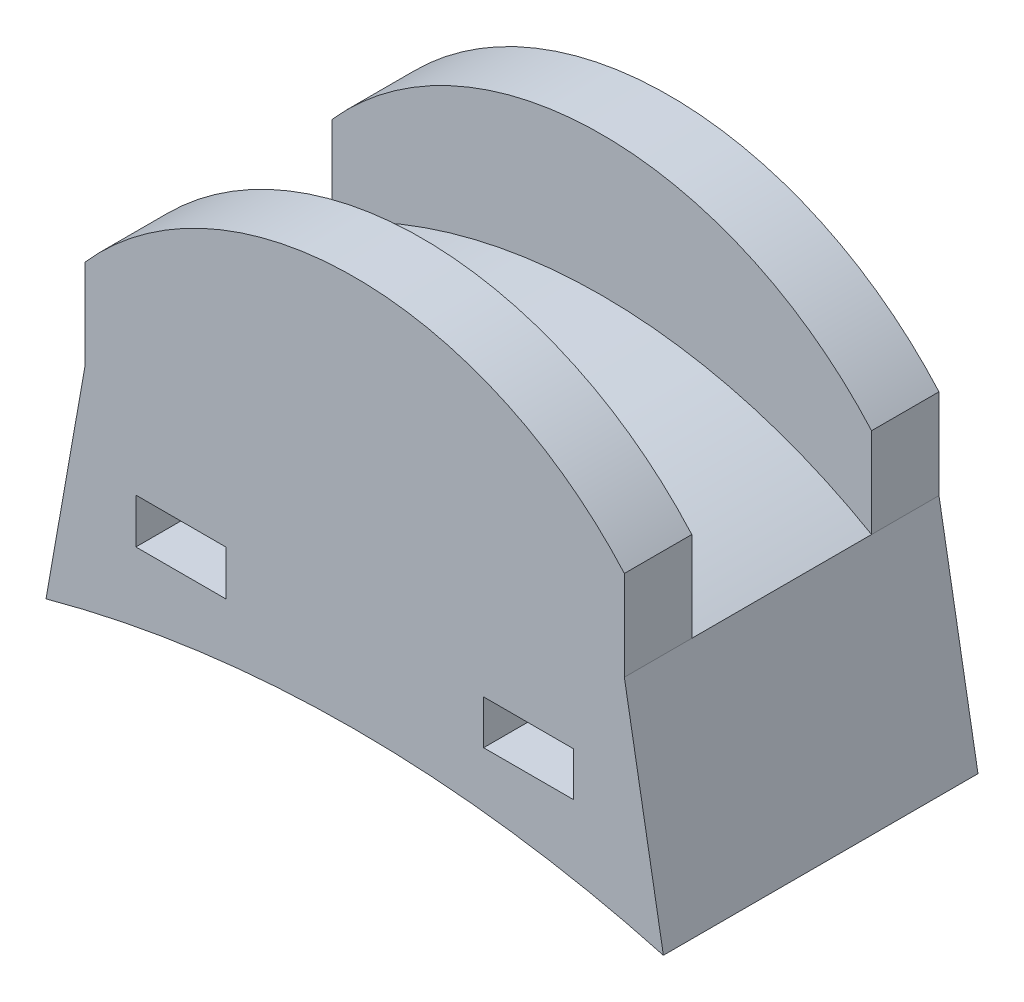
ISO-10303-21;
HEADER;
FILE_DESCRIPTION(('STEP AP214'),'2;1');
FILE_NAME('part.step','',(''),(''),'','','');
FILE_SCHEMA(('AUTOMOTIVE_DESIGN { 1 0 10303 214 1 1 1 1 }'));
ENDSEC;
DATA;
#1=APPLICATION_CONTEXT('core data for automotive mechanical design processes');
#2=APPLICATION_PROTOCOL_DEFINITION('international standard','automotive_design',2000,#1);
#3=PRODUCT_CONTEXT('',#1,'mechanical');
#4=PRODUCT('Part','Part','',(#3));
#5=PRODUCT_RELATED_PRODUCT_CATEGORY('part','',(#4));
#6=PRODUCT_DEFINITION_FORMATION('','',#4);
#7=PRODUCT_DEFINITION_CONTEXT('part definition',#1,'design');
#8=PRODUCT_DEFINITION('design','',#6,#7);
#9=PRODUCT_DEFINITION_SHAPE('','',#8);
#10=(LENGTH_UNIT() NAMED_UNIT(*) SI_UNIT(.MILLI.,.METRE.));
#11=(NAMED_UNIT(*) PLANE_ANGLE_UNIT() SI_UNIT($,.RADIAN.));
#12=(NAMED_UNIT(*) SI_UNIT($,.STERADIAN.) SOLID_ANGLE_UNIT());
#13=UNCERTAINTY_MEASURE_WITH_UNIT(LENGTH_MEASURE(1.E-05),#10,'distance_accuracy_value','');
#14=(GEOMETRIC_REPRESENTATION_CONTEXT(3) GLOBAL_UNCERTAINTY_ASSIGNED_CONTEXT((#13)) GLOBAL_UNIT_ASSIGNED_CONTEXT((#10,
#11,#12)) REPRESENTATION_CONTEXT('',''));
#15=CARTESIAN_POINT('',(0.,0.,0.));
#16=DIRECTION('',(0.,0.,1.));
#17=DIRECTION('',(1.,0.,0.));
#18=AXIS2_PLACEMENT_3D('',#15,#16,#17);
#19=CARTESIAN_POINT('',(-38.1,-65.9911357683742,25.4));
#20=DIRECTION('',(0.,0.,-1.));
#21=DIRECTION('',(-1.,0.,0.));
#22=AXIS2_PLACEMENT_3D('',#19,#20,#21);
#23=CYLINDRICAL_SURFACE('',#22,76.2);
#24=CARTESIAN_POINT('',(-38.1,-65.9911357683742,0.));
#25=DIRECTION('',(0.,0.,1.));
#26=DIRECTION('',(-1.,0.,0.));
#27=AXIS2_PLACEMENT_3D('',#24,#25,#26);
#28=CIRCLE('',#27,76.2);
#29=CARTESIAN_POINT('',(0.,0.,0.));
#30=VERTEX_POINT('',#29);
#31=CARTESIAN_POINT('',(-76.2,0.,0.));
#32=VERTEX_POINT('',#31);
#33=EDGE_CURVE('E297',#30,#32,#28,.T.);
#34=ORIENTED_EDGE('',*,*,#33,.T.);
#35=DIRECTION('',(0.,0.,-1.));
#36=VECTOR('',#35,1.);
#37=CARTESIAN_POINT('',(-76.2,0.,25.4));
#38=LINE('',#37,#36);
#39=CARTESIAN_POINT('',(-76.2,0.,25.4));
#40=VERTEX_POINT('',#39);
#41=EDGE_CURVE('E11',#40,#32,#38,.T.);
#42=ORIENTED_EDGE('',*,*,#41,.F.);
#43=CARTESIAN_POINT('',(-38.1,-65.9911357683742,25.4));
#44=DIRECTION('',(0.,0.,1.));
#45=DIRECTION('',(-1.,0.,0.));
#46=AXIS2_PLACEMENT_3D('',#43,#44,#45);
#47=CIRCLE('',#46,76.2);
#48=CARTESIAN_POINT('',(0.,0.,25.4));
#49=VERTEX_POINT('',#48);
#50=EDGE_CURVE('E298',#49,#40,#47,.T.);
#51=ORIENTED_EDGE('',*,*,#50,.F.);
#52=DIRECTION('',(0.,0.,-1.));
#53=VECTOR('',#52,1.);
#54=CARTESIAN_POINT('',(0.,0.,25.4));
#55=LINE('',#54,#53);
#56=EDGE_CURVE('E301',#49,#30,#55,.T.);
#57=ORIENTED_EDGE('',*,*,#56,.T.);
#58=EDGE_LOOP('',(#34,#42,#51,#57));
#59=FACE_BOUND('',#58,.T.);
#60=ADVANCED_FACE('F35',(#59),#23,.T.);
#61=CARTESIAN_POINT('',(-76.2,0.,25.4));
#62=DIRECTION('',(0.984807753012209,-0.173648177666927,0.));
#63=DIRECTION('',(0.173648177666927,0.984807753012209,0.));
#64=AXIS2_PLACEMENT_3D('',#61,#62,#63);
#65=PLANE('',#64);
#66=ORIENTED_EDGE('',*,*,#41,.T.);
#67=DIRECTION('',(0.,0.,1.));
#68=VECTOR('',#67,1.);
#69=CARTESIAN_POINT('',(-76.2,0.,-9.525));
#70=LINE('',#69,#68);
#71=CARTESIAN_POINT('',(-76.2,0.,-9.525));
#72=VERTEX_POINT('',#71);
#73=EDGE_CURVE('E261',#72,#32,#70,.T.);
#74=ORIENTED_EDGE('',*,*,#73,.F.);
#75=DIRECTION('',(0.173648177666927,0.984807753012209,0.));
#76=VECTOR('',#75,1.);
#77=CARTESIAN_POINT('',(-81.7133296409249,-31.2676461581376,-9.525));
#78=LINE('',#77,#76);
#79=CARTESIAN_POINT('',(-81.7133296409249,-31.2676461581376,-9.525));
#80=VERTEX_POINT('',#79);
#81=EDGE_CURVE('E238',#80,#72,#78,.T.);
#82=ORIENTED_EDGE('',*,*,#81,.F.);
#83=DIRECTION('',(0.,0.,-1.));
#84=VECTOR('',#83,1.);
#85=CARTESIAN_POINT('',(-81.7133296409249,-31.2676461581376,25.4));
#86=LINE('',#85,#84);
#87=CARTESIAN_POINT('',(-81.7133296409249,-31.2676461581376,34.925));
#88=VERTEX_POINT('',#87);
#89=EDGE_CURVE('E42',#88,#80,#86,.T.);
#90=ORIENTED_EDGE('',*,*,#89,.F.);
#91=DIRECTION('',(-0.173648177666927,-0.984807753012209,0.));
#92=VECTOR('',#91,1.);
#93=CARTESIAN_POINT('',(-73.9022888519432,13.0309674607077,34.925));
#94=LINE('',#93,#92);
#95=CARTESIAN_POINT('',(-76.2,0.,34.925));
#96=VERTEX_POINT('',#95);
#97=EDGE_CURVE('E274',#96,#88,#94,.T.);
#98=ORIENTED_EDGE('',*,*,#97,.F.);
#99=DIRECTION('',(0.,0.,-1.));
#100=VECTOR('',#99,1.);
#101=CARTESIAN_POINT('',(-76.2,0.,34.925));
#102=LINE('',#101,#100);
#103=EDGE_CURVE('E289',#96,#40,#102,.T.);
#104=ORIENTED_EDGE('',*,*,#103,.T.);
#105=EDGE_LOOP('',(#66,#74,#82,#90,#98,#104));
#106=FACE_BOUND('',#105,.T.);
#107=ADVANCED_FACE('F319',(#106),#65,.F.);
#108=CARTESIAN_POINT('',(0.,0.,25.4));
#109=DIRECTION('',(-0.984807753012207,-0.173648177666934,0.));
#110=DIRECTION('',(0.173648177666934,-0.984807753012207,0.));
#111=AXIS2_PLACEMENT_3D('',#108,#109,#110);
#112=PLANE('',#111);
#113=DIRECTION('',(0.,0.,-1.));
#114=VECTOR('',#113,1.);
#115=CARTESIAN_POINT('',(5.51332964092523,-31.267646158138,25.4));
#116=LINE('',#115,#114);
#117=CARTESIAN_POINT('',(5.51332964092523,-31.267646158138,34.925));
#118=VERTEX_POINT('',#117);
#119=CARTESIAN_POINT('',(5.51332964092523,-31.267646158138,-9.525));
#120=VERTEX_POINT('',#119);
#121=EDGE_CURVE('E306',#118,#120,#116,.T.);
#122=ORIENTED_EDGE('',*,*,#121,.T.);
#123=DIRECTION('',(0.173648177666934,-0.984807753012208,0.));
#124=VECTOR('',#123,1.);
#125=CARTESIAN_POINT('',(0.,0.,-9.525));
#126=LINE('',#125,#124);
#127=CARTESIAN_POINT('',(0.,0.,-9.525));
#128=VERTEX_POINT('',#127);
#129=EDGE_CURVE('E235',#128,#120,#126,.T.);
#130=ORIENTED_EDGE('',*,*,#129,.F.);
#131=DIRECTION('',(0.,0.,1.));
#132=VECTOR('',#131,1.);
#133=CARTESIAN_POINT('',(0.,0.,-9.525));
#134=LINE('',#133,#132);
#135=EDGE_CURVE('E247',#128,#30,#134,.T.);
#136=ORIENTED_EDGE('',*,*,#135,.T.);
#137=ORIENTED_EDGE('',*,*,#56,.F.);
#138=DIRECTION('',(0.,0.,-1.));
#139=VECTOR('',#138,1.);
#140=CARTESIAN_POINT('',(0.,0.,34.925));
#141=LINE('',#140,#139);
#142=CARTESIAN_POINT('',(0.,0.,34.925));
#143=VERTEX_POINT('',#142);
#144=EDGE_CURVE('E279',#143,#49,#141,.T.);
#145=ORIENTED_EDGE('',*,*,#144,.F.);
#146=DIRECTION('',(-0.173648177666934,0.984807753012208,0.));
#147=VECTOR('',#146,1.);
#148=CARTESIAN_POINT('',(0.,0.,34.925));
#149=LINE('',#148,#147);
#150=EDGE_CURVE('E277',#118,#143,#149,.T.);
#151=ORIENTED_EDGE('',*,*,#150,.F.);
#152=EDGE_LOOP('',(#122,#130,#136,#137,#145,#151));
#153=FACE_BOUND('',#152,.T.);
#154=ADVANCED_FACE('F335',(#153),#112,.F.);
#155=CARTESIAN_POINT('',(0.,0.,25.4));
#156=DIRECTION('',(0.,0.,1.));
#157=DIRECTION('',(1.,0.,0.));
#158=AXIS2_PLACEMENT_3D('',#155,#156,#157);
#159=PLANE('',#158);
#160=DIRECTION('',(0.,1.,0.));
#161=VECTOR('',#160,1.);
#162=CARTESIAN_POINT('',(0.,0.,25.4));
#163=LINE('',#162,#161);
#164=CARTESIAN_POINT('',(0.,12.7,25.4));
#165=VERTEX_POINT('',#164);
#166=EDGE_CURVE('E264',#49,#165,#163,.T.);
#167=ORIENTED_EDGE('',*,*,#166,.F.);
#168=ORIENTED_EDGE('',*,*,#50,.T.);
#169=DIRECTION('',(0.,1.,0.));
#170=VECTOR('',#169,1.);
#171=CARTESIAN_POINT('',(-76.2,0.,25.4));
#172=LINE('',#171,#170);
#173=CARTESIAN_POINT('',(-76.2,12.7,25.4));
#174=VERTEX_POINT('',#173);
#175=EDGE_CURVE('E269',#40,#174,#172,.T.);
#176=ORIENTED_EDGE('',*,*,#175,.T.);
#177=CARTESIAN_POINT('',(-38.1,-20.9010416505203,25.4));
#178=DIRECTION('',(0.,0.,1.));
#179=DIRECTION('',(1.,0.,0.));
#180=AXIS2_PLACEMENT_3D('',#177,#178,#179);
#181=CIRCLE('',#180,50.8);
#182=EDGE_CURVE('E282',#165,#174,#181,.T.);
#183=ORIENTED_EDGE('',*,*,#182,.F.);
#184=EDGE_LOOP('',(#167,#168,#176,#183));
#185=FACE_BOUND('',#184,.T.);
#186=ADVANCED_FACE('F346',(#185),#159,.F.);
#187=CARTESIAN_POINT('',(0.,0.,34.925));
#188=DIRECTION('',(-1.,0.,0.));
#189=DIRECTION('',(0.,0.,1.));
#190=AXIS2_PLACEMENT_3D('',#187,#188,#189);
#191=PLANE('',#190);
#192=ORIENTED_EDGE('',*,*,#166,.T.);
#193=DIRECTION('',(0.,0.,-1.));
#194=VECTOR('',#193,1.);
#195=CARTESIAN_POINT('',(0.,12.7,34.925));
#196=LINE('',#195,#194);
#197=CARTESIAN_POINT('',(0.,12.7,34.925));
#198=VERTEX_POINT('',#197);
#199=EDGE_CURVE('E294',#198,#165,#196,.T.);
#200=ORIENTED_EDGE('',*,*,#199,.F.);
#201=DIRECTION('',(0.,1.,0.));
#202=VECTOR('',#201,1.);
#203=CARTESIAN_POINT('',(0.,0.,34.925));
#204=LINE('',#203,#202);
#205=EDGE_CURVE('E265',#143,#198,#204,.T.);
#206=ORIENTED_EDGE('',*,*,#205,.F.);
#207=ORIENTED_EDGE('',*,*,#144,.T.);
#208=EDGE_LOOP('',(#192,#200,#206,#207));
#209=FACE_BOUND('',#208,.T.);
#210=ADVANCED_FACE('F351',(#209),#191,.F.);
#211=CARTESIAN_POINT('',(-38.1,-20.9010416505203,34.925));
#212=DIRECTION('',(0.,0.,-1.));
#213=DIRECTION('',(-1.,0.,0.));
#214=AXIS2_PLACEMENT_3D('',#211,#212,#213);
#215=CYLINDRICAL_SURFACE('',#214,50.8);
#216=ORIENTED_EDGE('',*,*,#182,.T.);
#217=DIRECTION('',(0.,0.,-1.));
#218=VECTOR('',#217,1.);
#219=CARTESIAN_POINT('',(-76.2,12.7,34.925));
#220=LINE('',#219,#218);
#221=CARTESIAN_POINT('',(-76.2,12.7,34.925));
#222=VERTEX_POINT('',#221);
#223=EDGE_CURVE('E292',#222,#174,#220,.T.);
#224=ORIENTED_EDGE('',*,*,#223,.F.);
#225=CARTESIAN_POINT('',(-38.1,-20.9010416505203,34.925));
#226=DIRECTION('',(0.,0.,1.));
#227=DIRECTION('',(1.,0.,0.));
#228=AXIS2_PLACEMENT_3D('',#225,#226,#227);
#229=CIRCLE('',#228,50.8);
#230=EDGE_CURVE('E268',#198,#222,#229,.T.);
#231=ORIENTED_EDGE('',*,*,#230,.F.);
#232=ORIENTED_EDGE('',*,*,#199,.T.);
#233=EDGE_LOOP('',(#216,#224,#231,#232));
#234=FACE_BOUND('',#233,.T.);
#235=ADVANCED_FACE('F354',(#234),#215,.T.);
#236=CARTESIAN_POINT('',(-76.2,0.,34.925));
#237=DIRECTION('',(-1.,0.,0.));
#238=DIRECTION('',(0.,0.,1.));
#239=AXIS2_PLACEMENT_3D('',#236,#237,#238);
#240=PLANE('',#239);
#241=ORIENTED_EDGE('',*,*,#175,.F.);
#242=ORIENTED_EDGE('',*,*,#103,.F.);
#243=DIRECTION('',(0.,1.,0.));
#244=VECTOR('',#243,1.);
#245=CARTESIAN_POINT('',(-76.2,0.,34.925));
#246=LINE('',#245,#244);
#247=EDGE_CURVE('E271',#96,#222,#246,.T.);
#248=ORIENTED_EDGE('',*,*,#247,.T.);
#249=ORIENTED_EDGE('',*,*,#223,.T.);
#250=EDGE_LOOP('',(#241,#242,#248,#249));
#251=FACE_BOUND('',#250,.T.);
#252=ADVANCED_FACE('F342',(#251),#240,.T.);
#253=CARTESIAN_POINT('',(0.,0.,34.925));
#254=DIRECTION('',(0.,0.,1.));
#255=DIRECTION('',(1.,0.,0.));
#256=AXIS2_PLACEMENT_3D('',#253,#254,#255);
#257=PLANE('',#256);
#258=DIRECTION('',(0.,-1.,0.));
#259=VECTOR('',#258,1.);
#260=CARTESIAN_POINT('',(-7.18667035907477,-12.344646158138,34.925));
#261=LINE('',#260,#259);
#262=CARTESIAN_POINT('',(-7.18667035907477,-12.344646158138,34.925));
#263=VERTEX_POINT('',#262);
#264=CARTESIAN_POINT('',(-7.18667035907477,-18.567646158138,34.925));
#265=VERTEX_POINT('',#264);
#266=EDGE_CURVE('E163',#263,#265,#261,.T.);
#267=ORIENTED_EDGE('',*,*,#266,.T.);
#268=DIRECTION('',(-1.,0.,0.));
#269=VECTOR('',#268,1.);
#270=CARTESIAN_POINT('',(-7.18667035907477,-18.567646158138,34.925));
#271=LINE('',#270,#269);
#272=CARTESIAN_POINT('',(-19.8866703590748,-18.567646158138,34.925));
#273=VERTEX_POINT('',#272);
#274=EDGE_CURVE('E174',#265,#273,#271,.T.);
#275=ORIENTED_EDGE('',*,*,#274,.T.);
#276=DIRECTION('',(0.,1.,0.));
#277=VECTOR('',#276,1.);
#278=CARTESIAN_POINT('',(-19.8866703590748,-12.344646158138,34.925));
#279=LINE('',#278,#277);
#280=CARTESIAN_POINT('',(-19.8866703590748,-12.344646158138,34.925));
#281=VERTEX_POINT('',#280);
#282=EDGE_CURVE('E49',#273,#281,#279,.T.);
#283=ORIENTED_EDGE('',*,*,#282,.T.);
#284=DIRECTION('',(1.,0.,0.));
#285=VECTOR('',#284,1.);
#286=CARTESIAN_POINT('',(-7.18667035907477,-12.344646158138,34.925));
#287=LINE('',#286,#285);
#288=EDGE_CURVE('E171',#281,#263,#287,.T.);
#289=ORIENTED_EDGE('',*,*,#288,.T.);
#290=EDGE_LOOP('',(#267,#275,#283,#289));
#291=FACE_BOUND('',#290,.T.);
#292=DIRECTION('',(0.,-1.,0.));
#293=VECTOR('',#292,1.);
#294=CARTESIAN_POINT('',(-56.3133296409249,-12.2176461581376,34.925));
#295=LINE('',#294,#293);
#296=CARTESIAN_POINT('',(-56.3133296409249,-12.2176461581376,34.925));
#297=VERTEX_POINT('',#296);
#298=CARTESIAN_POINT('',(-56.3133296409249,-18.5676461581376,34.925));
#299=VERTEX_POINT('',#298);
#300=EDGE_CURVE('E201',#297,#299,#295,.T.);
#301=ORIENTED_EDGE('',*,*,#300,.T.);
#302=DIRECTION('',(-1.,0.,0.));
#303=VECTOR('',#302,1.);
#304=CARTESIAN_POINT('',(-56.3133296409249,-18.5676461581376,34.925));
#305=LINE('',#304,#303);
#306=CARTESIAN_POINT('',(-69.0133296409249,-18.5676461581376,34.925));
#307=VERTEX_POINT('',#306);
#308=EDGE_CURVE('E204',#299,#307,#305,.T.);
#309=ORIENTED_EDGE('',*,*,#308,.T.);
#310=DIRECTION('',(0.,1.,0.));
#311=VECTOR('',#310,1.);
#312=CARTESIAN_POINT('',(-69.0133296409249,-12.2176461581376,34.925));
#313=LINE('',#312,#311);
#314=CARTESIAN_POINT('',(-69.0133296409249,-12.2176461581376,34.925));
#315=VERTEX_POINT('',#314);
#316=EDGE_CURVE('E57',#307,#315,#313,.T.);
#317=ORIENTED_EDGE('',*,*,#316,.T.);
#318=DIRECTION('',(1.,0.,0.));
#319=VECTOR('',#318,1.);
#320=CARTESIAN_POINT('',(-56.3133296409249,-12.2176461581376,34.925));
#321=LINE('',#320,#319);
#322=EDGE_CURVE('E209',#315,#297,#321,.T.);
#323=ORIENTED_EDGE('',*,*,#322,.T.);
#324=EDGE_LOOP('',(#301,#309,#317,#323));
#325=FACE_BOUND('',#324,.T.);
#326=CARTESIAN_POINT('',(-38.1000000000006,-190.502967232427,34.925));
#327=DIRECTION('',(0.,0.,-1.));
#328=DIRECTION('',(1.,0.,0.));
#329=AXIS2_PLACEMENT_3D('',#326,#327,#328);
#330=CIRCLE('',#329,165.1);
#331=EDGE_CURVE('E230',#88,#118,#330,.T.);
#332=ORIENTED_EDGE('',*,*,#331,.T.);
#333=ORIENTED_EDGE('',*,*,#150,.T.);
#334=ORIENTED_EDGE('',*,*,#205,.T.);
#335=ORIENTED_EDGE('',*,*,#230,.T.);
#336=ORIENTED_EDGE('',*,*,#247,.F.);
#337=ORIENTED_EDGE('',*,*,#97,.T.);
#338=EDGE_LOOP('',(#332,#333,#334,#335,#336,#337));
#339=FACE_BOUND('',#338,.T.);
#340=ADVANCED_FACE('F178',(#291,#325,#339),#257,.T.);
#341=CARTESIAN_POINT('',(-38.1,-20.9010416505203,0.));
#342=DIRECTION('',(0.,0.,1.));
#343=DIRECTION('',(1.,0.,0.));
#344=AXIS2_PLACEMENT_3D('',#341,#342,#343);
#345=PLANE('',#344);
#346=ORIENTED_EDGE('',*,*,#33,.F.);
#347=DIRECTION('',(0.,-1.,0.));
#348=VECTOR('',#347,1.);
#349=CARTESIAN_POINT('',(0.,0.,0.));
#350=LINE('',#349,#348);
#351=CARTESIAN_POINT('',(0.,12.7,0.));
#352=VERTEX_POINT('',#351);
#353=EDGE_CURVE('E239',#352,#30,#350,.T.);
#354=ORIENTED_EDGE('',*,*,#353,.F.);
#355=CARTESIAN_POINT('',(-38.1,-20.9010416505203,0.));
#356=DIRECTION('',(0.,0.,-1.));
#357=DIRECTION('',(1.,0.,0.));
#358=AXIS2_PLACEMENT_3D('',#355,#356,#357);
#359=CIRCLE('',#358,50.8);
#360=CARTESIAN_POINT('',(-76.2,12.7,0.));
#361=VERTEX_POINT('',#360);
#362=EDGE_CURVE('E249',#361,#352,#359,.T.);
#363=ORIENTED_EDGE('',*,*,#362,.F.);
#364=DIRECTION('',(0.,1.,0.));
#365=VECTOR('',#364,1.);
#366=CARTESIAN_POINT('',(-76.2,0.,0.));
#367=LINE('',#366,#365);
#368=EDGE_CURVE('E233',#32,#361,#367,.T.);
#369=ORIENTED_EDGE('',*,*,#368,.F.);
#370=EDGE_LOOP('',(#346,#354,#363,#369));
#371=FACE_BOUND('',#370,.T.);
#372=ADVANCED_FACE('F380',(#371),#345,.T.);
#373=CARTESIAN_POINT('',(-76.2,0.,-9.525));
#374=DIRECTION('',(1.,0.,0.));
#375=DIRECTION('',(0.,0.,-1.));
#376=AXIS2_PLACEMENT_3D('',#373,#374,#375);
#377=PLANE('',#376);
#378=ORIENTED_EDGE('',*,*,#368,.T.);
#379=DIRECTION('',(0.,0.,1.));
#380=VECTOR('',#379,1.);
#381=CARTESIAN_POINT('',(-76.2,12.7,-9.525));
#382=LINE('',#381,#380);
#383=CARTESIAN_POINT('',(-76.2,12.7,-9.525));
#384=VERTEX_POINT('',#383);
#385=EDGE_CURVE('E258',#384,#361,#382,.T.);
#386=ORIENTED_EDGE('',*,*,#385,.F.);
#387=DIRECTION('',(0.,1.,0.));
#388=VECTOR('',#387,1.);
#389=CARTESIAN_POINT('',(-76.2,0.,-9.525));
#390=LINE('',#389,#388);
#391=EDGE_CURVE('E241',#72,#384,#390,.T.);
#392=ORIENTED_EDGE('',*,*,#391,.F.);
#393=ORIENTED_EDGE('',*,*,#73,.T.);
#394=EDGE_LOOP('',(#378,#386,#392,#393));
#395=FACE_BOUND('',#394,.T.);
#396=ADVANCED_FACE('F323',(#395),#377,.F.);
#397=CARTESIAN_POINT('',(-38.1,-20.9010416505203,-9.525));
#398=DIRECTION('',(0.,0.,1.));
#399=DIRECTION('',(1.,0.,0.));
#400=AXIS2_PLACEMENT_3D('',#397,#398,#399);
#401=CYLINDRICAL_SURFACE('',#400,50.8);
#402=ORIENTED_EDGE('',*,*,#362,.T.);
#403=DIRECTION('',(0.,0.,1.));
#404=VECTOR('',#403,1.);
#405=CARTESIAN_POINT('',(0.,12.7,-9.525));
#406=LINE('',#405,#404);
#407=CARTESIAN_POINT('',(0.,12.7,-9.525));
#408=VERTEX_POINT('',#407);
#409=EDGE_CURVE('E255',#408,#352,#406,.T.);
#410=ORIENTED_EDGE('',*,*,#409,.F.);
#411=CARTESIAN_POINT('',(-38.1,-20.9010416505203,-9.525));
#412=DIRECTION('',(0.,0.,-1.));
#413=DIRECTION('',(1.,0.,0.));
#414=AXIS2_PLACEMENT_3D('',#411,#412,#413);
#415=CIRCLE('',#414,50.8);
#416=EDGE_CURVE('E243',#384,#408,#415,.T.);
#417=ORIENTED_EDGE('',*,*,#416,.F.);
#418=ORIENTED_EDGE('',*,*,#385,.T.);
#419=EDGE_LOOP('',(#402,#410,#417,#418));
#420=FACE_BOUND('',#419,.T.);
#421=ADVANCED_FACE('F329',(#420),#401,.T.);
#422=CARTESIAN_POINT('',(0.,0.,-9.525));
#423=DIRECTION('',(-1.,0.,0.));
#424=DIRECTION('',(0.,0.,1.));
#425=AXIS2_PLACEMENT_3D('',#422,#423,#424);
#426=PLANE('',#425);
#427=ORIENTED_EDGE('',*,*,#353,.T.);
#428=ORIENTED_EDGE('',*,*,#135,.F.);
#429=DIRECTION('',(0.,-1.,0.));
#430=VECTOR('',#429,1.);
#431=CARTESIAN_POINT('',(0.,0.,-9.525));
#432=LINE('',#431,#430);
#433=EDGE_CURVE('E245',#408,#128,#432,.T.);
#434=ORIENTED_EDGE('',*,*,#433,.F.);
#435=ORIENTED_EDGE('',*,*,#409,.T.);
#436=EDGE_LOOP('',(#427,#428,#434,#435));
#437=FACE_BOUND('',#436,.T.);
#438=ADVANCED_FACE('F333',(#437),#426,.F.);
#439=CARTESIAN_POINT('',(-38.1,-20.9010416505203,-9.525));
#440=DIRECTION('',(0.,0.,1.));
#441=DIRECTION('',(1.,0.,0.));
#442=AXIS2_PLACEMENT_3D('',#439,#440,#441);
#443=PLANE('',#442);
#444=DIRECTION('',(-1.,0.,0.));
#445=VECTOR('',#444,1.);
#446=CARTESIAN_POINT('',(-7.18667035907477,-18.567646158138,-9.525));
#447=LINE('',#446,#445);
#448=CARTESIAN_POINT('',(-7.18667035907477,-18.567646158138,-9.525));
#449=VERTEX_POINT('',#448);
#450=CARTESIAN_POINT('',(-19.8866703590748,-18.567646158138,-9.525));
#451=VERTEX_POINT('',#450);
#452=EDGE_CURVE('E190',#449,#451,#447,.T.);
#453=ORIENTED_EDGE('',*,*,#452,.F.);
#454=DIRECTION('',(0.,-1.,0.));
#455=VECTOR('',#454,1.);
#456=CARTESIAN_POINT('',(-7.18667035907477,-12.344646158138,-9.525));
#457=LINE('',#456,#455);
#458=CARTESIAN_POINT('',(-7.18667035907477,-12.344646158138,-9.525));
#459=VERTEX_POINT('',#458);
#460=EDGE_CURVE('E166',#459,#449,#457,.T.);
#461=ORIENTED_EDGE('',*,*,#460,.F.);
#462=DIRECTION('',(1.,0.,0.));
#463=VECTOR('',#462,1.);
#464=CARTESIAN_POINT('',(-7.18667035907477,-12.344646158138,-9.525));
#465=LINE('',#464,#463);
#466=CARTESIAN_POINT('',(-19.8866703590748,-12.344646158138,-9.525));
#467=VERTEX_POINT('',#466);
#468=EDGE_CURVE('E181',#467,#459,#465,.T.);
#469=ORIENTED_EDGE('',*,*,#468,.F.);
#470=DIRECTION('',(0.,1.,0.));
#471=VECTOR('',#470,1.);
#472=CARTESIAN_POINT('',(-19.8866703590748,-12.344646158138,-9.525));
#473=LINE('',#472,#471);
#474=EDGE_CURVE('E184',#451,#467,#473,.T.);
#475=ORIENTED_EDGE('',*,*,#474,.F.);
#476=EDGE_LOOP('',(#453,#461,#469,#475));
#477=FACE_BOUND('',#476,.T.);
#478=DIRECTION('',(-1.,0.,0.));
#479=VECTOR('',#478,1.);
#480=CARTESIAN_POINT('',(-56.3133296409249,-18.5676461581376,-9.525));
#481=LINE('',#480,#479);
#482=CARTESIAN_POINT('',(-56.3133296409249,-18.5676461581376,-9.525));
#483=VERTEX_POINT('',#482);
#484=CARTESIAN_POINT('',(-69.0133296409249,-18.5676461581376,-9.525));
#485=VERTEX_POINT('',#484);
#486=EDGE_CURVE('E215',#483,#485,#481,.T.);
#487=ORIENTED_EDGE('',*,*,#486,.F.);
#488=DIRECTION('',(0.,-1.,0.));
#489=VECTOR('',#488,1.);
#490=CARTESIAN_POINT('',(-56.3133296409249,-12.2176461581376,-9.525));
#491=LINE('',#490,#489);
#492=CARTESIAN_POINT('',(-56.3133296409249,-12.2176461581376,-9.525));
#493=VERTEX_POINT('',#492);
#494=EDGE_CURVE('E213',#493,#483,#491,.T.);
#495=ORIENTED_EDGE('',*,*,#494,.F.);
#496=DIRECTION('',(1.,0.,0.));
#497=VECTOR('',#496,1.);
#498=CARTESIAN_POINT('',(-56.3133296409249,-12.2176461581376,-9.525));
#499=LINE('',#498,#497);
#500=CARTESIAN_POINT('',(-69.0133296409249,-12.2176461581376,-9.525));
#501=VERTEX_POINT('',#500);
#502=EDGE_CURVE('E205',#501,#493,#499,.T.);
#503=ORIENTED_EDGE('',*,*,#502,.F.);
#504=DIRECTION('',(0.,1.,0.));
#505=VECTOR('',#504,1.);
#506=CARTESIAN_POINT('',(-69.0133296409249,-12.2176461581376,-9.525));
#507=LINE('',#506,#505);
#508=EDGE_CURVE('E218',#485,#501,#507,.T.);
#509=ORIENTED_EDGE('',*,*,#508,.F.);
#510=EDGE_LOOP('',(#487,#495,#503,#509));
#511=FACE_BOUND('',#510,.T.);
#512=ORIENTED_EDGE('',*,*,#129,.T.);
#513=CARTESIAN_POINT('',(-38.1000000000006,-190.502967232427,-9.525));
#514=DIRECTION('',(0.,0.,-1.));
#515=DIRECTION('',(1.,0.,0.));
#516=AXIS2_PLACEMENT_3D('',#513,#514,#515);
#517=CIRCLE('',#516,165.1);
#518=EDGE_CURVE('E197',#80,#120,#517,.T.);
#519=ORIENTED_EDGE('',*,*,#518,.F.);
#520=ORIENTED_EDGE('',*,*,#81,.T.);
#521=ORIENTED_EDGE('',*,*,#391,.T.);
#522=ORIENTED_EDGE('',*,*,#416,.T.);
#523=ORIENTED_EDGE('',*,*,#433,.T.);
#524=EDGE_LOOP('',(#512,#519,#520,#521,#522,#523));
#525=FACE_BOUND('',#524,.T.);
#526=ADVANCED_FACE('F316',(#477,#511,#525),#443,.F.);
#527=CARTESIAN_POINT('',(-38.1000000000006,-190.502967232427,34.925));
#528=DIRECTION('',(0.,0.,-1.));
#529=DIRECTION('',(-1.,0.,0.));
#530=AXIS2_PLACEMENT_3D('',#527,#528,#529);
#531=CYLINDRICAL_SURFACE('',#530,165.1);
#532=ORIENTED_EDGE('',*,*,#518,.T.);
#533=ORIENTED_EDGE('',*,*,#121,.F.);
#534=ORIENTED_EDGE('',*,*,#331,.F.);
#535=ORIENTED_EDGE('',*,*,#89,.T.);
#536=EDGE_LOOP('',(#532,#533,#534,#535));
#537=FACE_BOUND('',#536,.T.);
#538=ADVANCED_FACE('F311',(#537),#531,.F.);
#539=CARTESIAN_POINT('',(-56.3133296409249,-12.2176461581376,34.925));
#540=DIRECTION('',(1.,0.,0.));
#541=DIRECTION('',(0.,0.,-1.));
#542=AXIS2_PLACEMENT_3D('',#539,#540,#541);
#543=PLANE('',#542);
#544=ORIENTED_EDGE('',*,*,#494,.T.);
#545=DIRECTION('',(0.,0.,-1.));
#546=VECTOR('',#545,1.);
#547=CARTESIAN_POINT('',(-56.3133296409249,-18.5676461581376,34.925));
#548=LINE('',#547,#546);
#549=EDGE_CURVE('E212',#299,#483,#548,.T.);
#550=ORIENTED_EDGE('',*,*,#549,.F.);
#551=ORIENTED_EDGE('',*,*,#300,.F.);
#552=DIRECTION('',(0.,0.,-1.));
#553=VECTOR('',#552,1.);
#554=CARTESIAN_POINT('',(-56.3133296409249,-12.2176461581376,34.925));
#555=LINE('',#554,#553);
#556=EDGE_CURVE('E191',#297,#493,#555,.T.);
#557=ORIENTED_EDGE('',*,*,#556,.T.);
#558=EDGE_LOOP('',(#544,#550,#551,#557));
#559=FACE_BOUND('',#558,.T.);
#560=ADVANCED_FACE('F395',(#559),#543,.F.);
#561=CARTESIAN_POINT('',(-56.3133296409249,-12.2176461581376,34.925));
#562=DIRECTION('',(0.,1.,0.));
#563=DIRECTION('',(0.,0.,1.));
#564=AXIS2_PLACEMENT_3D('',#561,#562,#563);
#565=PLANE('',#564);
#566=ORIENTED_EDGE('',*,*,#502,.T.);
#567=ORIENTED_EDGE('',*,*,#556,.F.);
#568=ORIENTED_EDGE('',*,*,#322,.F.);
#569=DIRECTION('',(0.,0.,-1.));
#570=VECTOR('',#569,1.);
#571=CARTESIAN_POINT('',(-69.0133296409249,-12.2176461581376,34.925));
#572=LINE('',#571,#570);
#573=EDGE_CURVE('E224',#315,#501,#572,.T.);
#574=ORIENTED_EDGE('',*,*,#573,.T.);
#575=EDGE_LOOP('',(#566,#567,#568,#574));
#576=FACE_BOUND('',#575,.T.);
#577=ADVANCED_FACE('F398',(#576),#565,.F.);
#578=CARTESIAN_POINT('',(-69.0133296409249,-12.2176461581376,34.925));
#579=DIRECTION('',(-1.,0.,0.));
#580=DIRECTION('',(0.,0.,1.));
#581=AXIS2_PLACEMENT_3D('',#578,#579,#580);
#582=PLANE('',#581);
#583=ORIENTED_EDGE('',*,*,#508,.T.);
#584=ORIENTED_EDGE('',*,*,#573,.F.);
#585=ORIENTED_EDGE('',*,*,#316,.F.);
#586=DIRECTION('',(0.,0.,-1.));
#587=VECTOR('',#586,1.);
#588=CARTESIAN_POINT('',(-69.0133296409249,-18.5676461581376,34.925));
#589=LINE('',#588,#587);
#590=EDGE_CURVE('E226',#307,#485,#589,.T.);
#591=ORIENTED_EDGE('',*,*,#590,.T.);
#592=EDGE_LOOP('',(#583,#584,#585,#591));
#593=FACE_BOUND('',#592,.T.);
#594=ADVANCED_FACE('F403',(#593),#582,.F.);
#595=CARTESIAN_POINT('',(-56.3133296409249,-18.5676461581376,34.925));
#596=DIRECTION('',(0.,-1.,0.));
#597=DIRECTION('',(1.,0.,0.));
#598=AXIS2_PLACEMENT_3D('',#595,#596,#597);
#599=PLANE('',#598);
#600=ORIENTED_EDGE('',*,*,#486,.T.);
#601=ORIENTED_EDGE('',*,*,#590,.F.);
#602=ORIENTED_EDGE('',*,*,#308,.F.);
#603=ORIENTED_EDGE('',*,*,#549,.T.);
#604=EDGE_LOOP('',(#600,#601,#602,#603));
#605=FACE_BOUND('',#604,.T.);
#606=ADVANCED_FACE('F400',(#605),#599,.F.);
#607=CARTESIAN_POINT('',(-7.18667035907477,-12.344646158138,34.925));
#608=DIRECTION('',(1.,0.,0.));
#609=DIRECTION('',(0.,1.,0.));
#610=AXIS2_PLACEMENT_3D('',#607,#608,#609);
#611=PLANE('',#610);
#612=ORIENTED_EDGE('',*,*,#460,.T.);
#613=DIRECTION('',(0.,0.,-1.));
#614=VECTOR('',#613,1.);
#615=CARTESIAN_POINT('',(-7.18667035907477,-18.567646158138,34.925));
#616=LINE('',#615,#614);
#617=EDGE_CURVE('E159',#265,#449,#616,.T.);
#618=ORIENTED_EDGE('',*,*,#617,.F.);
#619=ORIENTED_EDGE('',*,*,#266,.F.);
#620=DIRECTION('',(0.,0.,-1.));
#621=VECTOR('',#620,1.);
#622=CARTESIAN_POINT('',(-7.18667035907477,-12.344646158138,34.925));
#623=LINE('',#622,#621);
#624=EDGE_CURVE('E195',#263,#459,#623,.T.);
#625=ORIENTED_EDGE('',*,*,#624,.T.);
#626=EDGE_LOOP('',(#612,#618,#619,#625));
#627=FACE_BOUND('',#626,.T.);
#628=ADVANCED_FACE('F161',(#627),#611,.F.);
#629=CARTESIAN_POINT('',(-7.18667035907477,-12.344646158138,34.925));
#630=DIRECTION('',(0.,1.,0.));
#631=DIRECTION('',(0.,0.,1.));
#632=AXIS2_PLACEMENT_3D('',#629,#630,#631);
#633=PLANE('',#632);
#634=ORIENTED_EDGE('',*,*,#468,.T.);
#635=ORIENTED_EDGE('',*,*,#624,.F.);
#636=ORIENTED_EDGE('',*,*,#288,.F.);
#637=DIRECTION('',(0.,0.,-1.));
#638=VECTOR('',#637,1.);
#639=CARTESIAN_POINT('',(-19.8866703590748,-12.344646158138,34.925));
#640=LINE('',#639,#638);
#641=EDGE_CURVE('E198',#281,#467,#640,.T.);
#642=ORIENTED_EDGE('',*,*,#641,.T.);
#643=EDGE_LOOP('',(#634,#635,#636,#642));
#644=FACE_BOUND('',#643,.T.);
#645=ADVANCED_FACE('F412',(#644),#633,.F.);
#646=CARTESIAN_POINT('',(-19.8866703590748,-12.344646158138,34.925));
#647=DIRECTION('',(-1.,0.,0.));
#648=DIRECTION('',(0.,0.,1.));
#649=AXIS2_PLACEMENT_3D('',#646,#647,#648);
#650=PLANE('',#649);
#651=ORIENTED_EDGE('',*,*,#474,.T.);
#652=ORIENTED_EDGE('',*,*,#641,.F.);
#653=ORIENTED_EDGE('',*,*,#282,.F.);
#654=DIRECTION('',(0.,0.,-1.));
#655=VECTOR('',#654,1.);
#656=CARTESIAN_POINT('',(-19.8866703590748,-18.567646158138,34.925));
#657=LINE('',#656,#655);
#658=EDGE_CURVE('E170',#273,#451,#657,.T.);
#659=ORIENTED_EDGE('',*,*,#658,.T.);
#660=EDGE_LOOP('',(#651,#652,#653,#659));
#661=FACE_BOUND('',#660,.T.);
#662=ADVANCED_FACE('F415',(#661),#650,.F.);
#663=CARTESIAN_POINT('',(-7.18667035907477,-18.567646158138,34.925));
#664=DIRECTION('',(0.,-1.,0.));
#665=DIRECTION('',(0.,0.,-1.));
#666=AXIS2_PLACEMENT_3D('',#663,#664,#665);
#667=PLANE('',#666);
#668=ORIENTED_EDGE('',*,*,#452,.T.);
#669=ORIENTED_EDGE('',*,*,#658,.F.);
#670=ORIENTED_EDGE('',*,*,#274,.F.);
#671=ORIENTED_EDGE('',*,*,#617,.T.);
#672=EDGE_LOOP('',(#668,#669,#670,#671));
#673=FACE_BOUND('',#672,.T.);
#674=ADVANCED_FACE('F175',(#673),#667,.F.);
#675=CLOSED_SHELL('',(#60,#107,#154,#186,#210,#235,#252,#340,#372,#396,#421,#438,#526,#538,#560,
#577,#594,#606,#628,#645,#662,#674));
#676=MANIFOLD_SOLID_BREP('B2',#675);
#677=ADVANCED_BREP_SHAPE_REPRESENTATION('',(#18,#676),#14);
#678=SHAPE_DEFINITION_REPRESENTATION(#9,#677);
ENDSEC;
END-ISO-10303-21;
